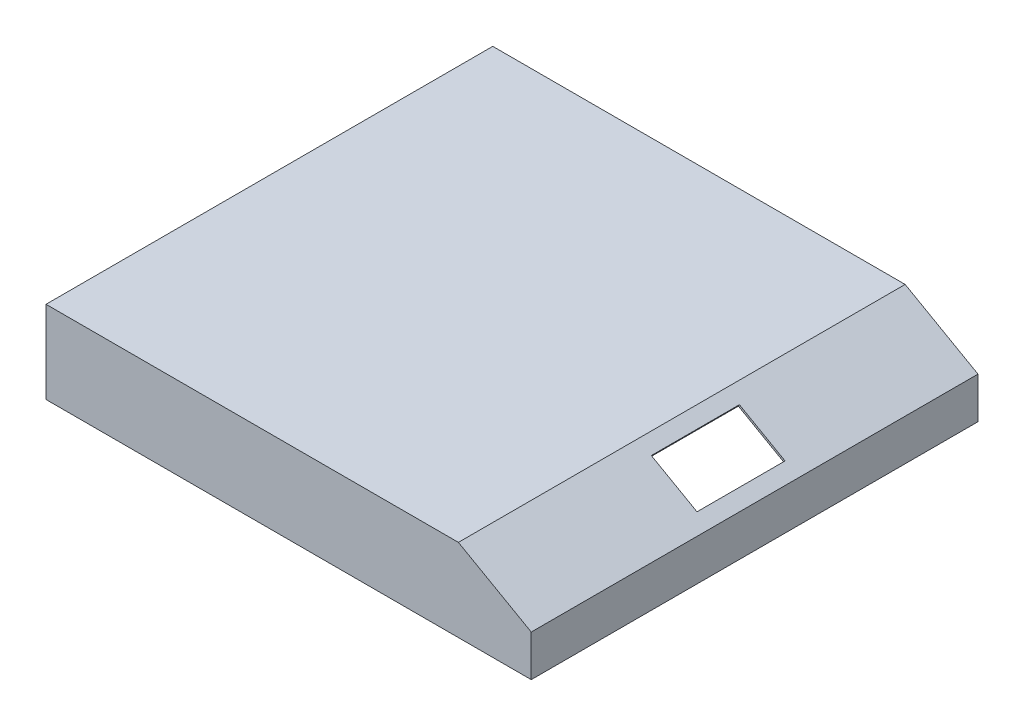
ISO-10303-21;
HEADER;
FILE_DESCRIPTION(('STEP AP214'),'2;1');
FILE_NAME('part.step','',(''),(''),'','','');
FILE_SCHEMA(('AUTOMOTIVE_DESIGN { 1 0 10303 214 1 1 1 1 }'));
ENDSEC;
DATA;
#1=APPLICATION_CONTEXT('core data for automotive mechanical design processes');
#2=APPLICATION_PROTOCOL_DEFINITION('international standard','automotive_design',2000,#1);
#3=PRODUCT_CONTEXT('',#1,'mechanical');
#4=PRODUCT('Part','Part','',(#3));
#5=PRODUCT_RELATED_PRODUCT_CATEGORY('part','',(#4));
#6=PRODUCT_DEFINITION_FORMATION('','',#4);
#7=PRODUCT_DEFINITION_CONTEXT('part definition',#1,'design');
#8=PRODUCT_DEFINITION('design','',#6,#7);
#9=PRODUCT_DEFINITION_SHAPE('','',#8);
#10=(LENGTH_UNIT() NAMED_UNIT(*) SI_UNIT(.MILLI.,.METRE.));
#11=(NAMED_UNIT(*) PLANE_ANGLE_UNIT() SI_UNIT($,.RADIAN.));
#12=(NAMED_UNIT(*) SI_UNIT($,.STERADIAN.) SOLID_ANGLE_UNIT());
#13=UNCERTAINTY_MEASURE_WITH_UNIT(LENGTH_MEASURE(1.E-05),#10,'distance_accuracy_value','');
#14=(GEOMETRIC_REPRESENTATION_CONTEXT(3) GLOBAL_UNCERTAINTY_ASSIGNED_CONTEXT((#13)) GLOBAL_UNIT_ASSIGNED_CONTEXT((#10,
#11,#12)) REPRESENTATION_CONTEXT('',''));
#15=CARTESIAN_POINT('',(0.,0.,0.));
#16=DIRECTION('',(0.,0.,1.));
#17=DIRECTION('',(1.,0.,0.));
#18=AXIS2_PLACEMENT_3D('',#15,#16,#17);
#19=CARTESIAN_POINT('',(705.985097205916,0.,325.));
#20=DIRECTION('',(0.,1.,0.));
#21=DIRECTION('',(0.,0.,1.));
#22=AXIS2_PLACEMENT_3D('',#19,#20,#21);
#23=PLANE('',#22);
#24=DIRECTION('',(1.,0.,0.));
#25=VECTOR('',#24,1.);
#26=CARTESIAN_POINT('',(705.985097205916,0.,-325.));
#27=LINE('',#26,#25);
#28=CARTESIAN_POINT('',(0.,0.,-325.));
#29=VERTEX_POINT('',#28);
#30=CARTESIAN_POINT('',(705.985097205916,0.,-325.));
#31=VERTEX_POINT('',#30);
#32=EDGE_CURVE('E192',#29,#31,#27,.T.);
#33=ORIENTED_EDGE('',*,*,#32,.T.);
#34=DIRECTION('',(0.,0.,-1.));
#35=VECTOR('',#34,1.);
#36=CARTESIAN_POINT('',(705.985097205916,0.,325.));
#37=LINE('',#36,#35);
#38=CARTESIAN_POINT('',(705.985097205916,0.,325.));
#39=VERTEX_POINT('',#38);
#40=EDGE_CURVE('E232',#39,#31,#37,.T.);
#41=ORIENTED_EDGE('',*,*,#40,.F.);
#42=DIRECTION('',(1.,0.,0.));
#43=VECTOR('',#42,1.);
#44=CARTESIAN_POINT('',(705.985097205916,0.,325.));
#45=LINE('',#44,#43);
#46=CARTESIAN_POINT('',(0.,0.,325.));
#47=VERTEX_POINT('',#46);
#48=EDGE_CURVE('E199',#47,#39,#45,.T.);
#49=ORIENTED_EDGE('',*,*,#48,.F.);
#50=DIRECTION('',(0.,0.,-1.));
#51=VECTOR('',#50,1.);
#52=CARTESIAN_POINT('',(0.,0.,325.));
#53=LINE('',#52,#51);
#54=EDGE_CURVE('E211',#47,#29,#53,.T.);
#55=ORIENTED_EDGE('',*,*,#54,.T.);
#56=EDGE_LOOP('',(#33,#41,#49,#55));
#57=FACE_BOUND('',#56,.T.);
#58=DIRECTION('',(1.,0.,0.));
#59=VECTOR('',#58,1.);
#60=CARTESIAN_POINT('',(0.,0.,-322.));
#61=LINE('',#60,#59);
#62=CARTESIAN_POINT('',(3.,0.,-322.));
#63=VERTEX_POINT('',#62);
#64=CARTESIAN_POINT('',(702.985097205916,0.,-322.));
#65=VERTEX_POINT('',#64);
#66=EDGE_CURVE('E158',#63,#65,#61,.T.);
#67=ORIENTED_EDGE('',*,*,#66,.F.);
#68=DIRECTION('',(0.,0.,-1.));
#69=VECTOR('',#68,1.);
#70=CARTESIAN_POINT('',(3.,0.,325.));
#71=LINE('',#70,#69);
#72=CARTESIAN_POINT('',(3.,0.,322.));
#73=VERTEX_POINT('',#72);
#74=EDGE_CURVE('E184',#73,#63,#71,.T.);
#75=ORIENTED_EDGE('',*,*,#74,.F.);
#76=DIRECTION('',(1.,0.,0.));
#77=VECTOR('',#76,1.);
#78=CARTESIAN_POINT('',(0.,0.,322.));
#79=LINE('',#78,#77);
#80=CARTESIAN_POINT('',(702.985097205916,0.,322.));
#81=VERTEX_POINT('',#80);
#82=EDGE_CURVE('E172',#73,#81,#79,.T.);
#83=ORIENTED_EDGE('',*,*,#82,.T.);
#84=DIRECTION('',(0.,0.,-1.));
#85=VECTOR('',#84,1.);
#86=CARTESIAN_POINT('',(702.985097205916,0.,325.));
#87=LINE('',#86,#85);
#88=EDGE_CURVE('E167',#81,#65,#87,.T.);
#89=ORIENTED_EDGE('',*,*,#88,.T.);
#90=EDGE_LOOP('',(#67,#75,#83,#89));
#91=FACE_BOUND('',#90,.T.);
#92=ADVANCED_FACE('F33',(#57,#91),#23,.F.);
#93=CARTESIAN_POINT('',(705.985097205916,60.,325.));
#94=DIRECTION('',(-1.,0.,0.));
#95=DIRECTION('',(0.,0.,1.));
#96=AXIS2_PLACEMENT_3D('',#93,#94,#95);
#97=PLANE('',#96);
#98=DIRECTION('',(0.,1.,0.));
#99=VECTOR('',#98,1.);
#100=CARTESIAN_POINT('',(705.985097205916,60.,-325.));
#101=LINE('',#100,#99);
#102=CARTESIAN_POINT('',(705.985097205916,60.,-325.));
#103=VERTEX_POINT('',#102);
#104=EDGE_CURVE('E214',#31,#103,#101,.T.);
#105=ORIENTED_EDGE('',*,*,#104,.T.);
#106=DIRECTION('',(0.,0.,-1.));
#107=VECTOR('',#106,1.);
#108=CARTESIAN_POINT('',(705.985097205916,60.,325.));
#109=LINE('',#108,#107);
#110=CARTESIAN_POINT('',(705.985097205916,60.,325.));
#111=VERTEX_POINT('',#110);
#112=EDGE_CURVE('E229',#111,#103,#109,.T.);
#113=ORIENTED_EDGE('',*,*,#112,.F.);
#114=DIRECTION('',(0.,1.,0.));
#115=VECTOR('',#114,1.);
#116=CARTESIAN_POINT('',(705.985097205916,60.,325.));
#117=LINE('',#116,#115);
#118=EDGE_CURVE('E202',#39,#111,#117,.T.);
#119=ORIENTED_EDGE('',*,*,#118,.F.);
#120=ORIENTED_EDGE('',*,*,#40,.T.);
#121=EDGE_LOOP('',(#105,#113,#119,#120));
#122=FACE_BOUND('',#121,.T.);
#123=ADVANCED_FACE('F260',(#122),#97,.F.);
#124=CARTESIAN_POINT('',(600.,120.,325.));
#125=DIRECTION('',(-0.492650675035758,-0.870227161370416,0.));
#126=DIRECTION('',(0.870227161370416,-0.492650675035758,0.));
#127=AXIS2_PLACEMENT_3D('',#124,#125,#126);
#128=PLANE('',#127);
#129=DIRECTION('',(-0.870227161370416,0.492650675035758,0.));
#130=VECTOR('',#129,1.);
#131=CARTESIAN_POINT('',(619.758067441577,108.814615660621,-64.0782377758612));
#132=LINE('',#131,#130);
#133=CARTESIAN_POINT('',(686.227029764339,71.185384339379,-64.0782377758611));
#134=VERTEX_POINT('',#133);
#135=CARTESIAN_POINT('',(619.758067441577,108.814615660621,-64.0782377758612));
#136=VERTEX_POINT('',#135);
#137=EDGE_CURVE('E144',#134,#136,#132,.T.);
#138=ORIENTED_EDGE('',*,*,#137,.F.);
#139=DIRECTION('',(0.,0.,-1.));
#140=VECTOR('',#139,1.);
#141=CARTESIAN_POINT('',(686.227029764339,71.1853843393789,-64.0782377758612));
#142=LINE('',#141,#140);
#143=CARTESIAN_POINT('',(686.227029764339,71.1853843393789,64.0782377758612));
#144=VERTEX_POINT('',#143);
#145=EDGE_CURVE('E47',#144,#134,#142,.T.);
#146=ORIENTED_EDGE('',*,*,#145,.F.);
#147=DIRECTION('',(0.870227161370416,-0.492650675035758,0.));
#148=VECTOR('',#147,1.);
#149=CARTESIAN_POINT('',(619.758067441577,108.814615660621,64.0782377758612));
#150=LINE('',#149,#148);
#151=CARTESIAN_POINT('',(619.758067441577,108.814615660621,64.0782377758612));
#152=VERTEX_POINT('',#151);
#153=EDGE_CURVE('E151',#152,#144,#150,.T.);
#154=ORIENTED_EDGE('',*,*,#153,.F.);
#155=DIRECTION('',(0.,0.,1.));
#156=VECTOR('',#155,1.);
#157=CARTESIAN_POINT('',(619.758067441577,108.814615660621,-64.0782377758612));
#158=LINE('',#157,#156);
#159=EDGE_CURVE('E135',#136,#152,#158,.T.);
#160=ORIENTED_EDGE('',*,*,#159,.F.);
#161=EDGE_LOOP('',(#138,#146,#154,#160));
#162=FACE_BOUND('',#161,.T.);
#163=DIRECTION('',(-0.870227161370416,0.492650675035758,0.));
#164=VECTOR('',#163,1.);
#165=CARTESIAN_POINT('',(600.,120.,-325.));
#166=LINE('',#165,#164);
#167=CARTESIAN_POINT('',(600.,120.,-325.));
#168=VERTEX_POINT('',#167);
#169=EDGE_CURVE('E216',#103,#168,#166,.T.);
#170=ORIENTED_EDGE('',*,*,#169,.T.);
#171=DIRECTION('',(0.,0.,-1.));
#172=VECTOR('',#171,1.);
#173=CARTESIAN_POINT('',(600.,120.,325.));
#174=LINE('',#173,#172);
#175=CARTESIAN_POINT('',(600.,120.,325.));
#176=VERTEX_POINT('',#175);
#177=EDGE_CURVE('E226',#176,#168,#174,.T.);
#178=ORIENTED_EDGE('',*,*,#177,.F.);
#179=DIRECTION('',(-0.870227161370416,0.492650675035758,0.));
#180=VECTOR('',#179,1.);
#181=CARTESIAN_POINT('',(600.,120.,325.));
#182=LINE('',#181,#180);
#183=EDGE_CURVE('E205',#111,#176,#182,.T.);
#184=ORIENTED_EDGE('',*,*,#183,.F.);
#185=ORIENTED_EDGE('',*,*,#112,.T.);
#186=EDGE_LOOP('',(#170,#178,#184,#185));
#187=FACE_BOUND('',#186,.T.);
#188=ADVANCED_FACE('F148',(#162,#187),#128,.F.);
#189=CARTESIAN_POINT('',(0.,120.,325.));
#190=DIRECTION('',(0.,-1.,0.));
#191=DIRECTION('',(0.,0.,-1.));
#192=AXIS2_PLACEMENT_3D('',#189,#190,#191);
#193=PLANE('',#192);
#194=DIRECTION('',(-1.,0.,0.));
#195=VECTOR('',#194,1.);
#196=CARTESIAN_POINT('',(0.,120.,-325.));
#197=LINE('',#196,#195);
#198=CARTESIAN_POINT('',(0.,120.,-325.));
#199=VERTEX_POINT('',#198);
#200=EDGE_CURVE('E218',#168,#199,#197,.T.);
#201=ORIENTED_EDGE('',*,*,#200,.T.);
#202=DIRECTION('',(0.,0.,-1.));
#203=VECTOR('',#202,1.);
#204=CARTESIAN_POINT('',(0.,120.,325.));
#205=LINE('',#204,#203);
#206=CARTESIAN_POINT('',(0.,120.,325.));
#207=VERTEX_POINT('',#206);
#208=EDGE_CURVE('E223',#207,#199,#205,.T.);
#209=ORIENTED_EDGE('',*,*,#208,.F.);
#210=DIRECTION('',(-1.,0.,0.));
#211=VECTOR('',#210,1.);
#212=CARTESIAN_POINT('',(0.,120.,325.));
#213=LINE('',#212,#211);
#214=EDGE_CURVE('E207',#176,#207,#213,.T.);
#215=ORIENTED_EDGE('',*,*,#214,.F.);
#216=ORIENTED_EDGE('',*,*,#177,.T.);
#217=EDGE_LOOP('',(#201,#209,#215,#216));
#218=FACE_BOUND('',#217,.T.);
#219=ADVANCED_FACE('F310',(#218),#193,.F.);
#220=CARTESIAN_POINT('',(0.,0.,325.));
#221=DIRECTION('',(1.,0.,0.));
#222=DIRECTION('',(0.,0.,-1.));
#223=AXIS2_PLACEMENT_3D('',#220,#221,#222);
#224=PLANE('',#223);
#225=DIRECTION('',(0.,-1.,0.));
#226=VECTOR('',#225,1.);
#227=CARTESIAN_POINT('',(0.,0.,-325.));
#228=LINE('',#227,#226);
#229=EDGE_CURVE('E203',#199,#29,#228,.T.);
#230=ORIENTED_EDGE('',*,*,#229,.T.);
#231=ORIENTED_EDGE('',*,*,#54,.F.);
#232=DIRECTION('',(0.,-1.,0.));
#233=VECTOR('',#232,1.);
#234=CARTESIAN_POINT('',(0.,0.,325.));
#235=LINE('',#234,#233);
#236=EDGE_CURVE('E209',#207,#47,#235,.T.);
#237=ORIENTED_EDGE('',*,*,#236,.F.);
#238=ORIENTED_EDGE('',*,*,#208,.T.);
#239=EDGE_LOOP('',(#230,#231,#237,#238));
#240=FACE_BOUND('',#239,.T.);
#241=ADVANCED_FACE('F303',(#240),#224,.F.);
#242=CARTESIAN_POINT('',(0.,0.,325.));
#243=DIRECTION('',(0.,0.,-1.));
#244=DIRECTION('',(-1.,0.,0.));
#245=AXIS2_PLACEMENT_3D('',#242,#243,#244);
#246=PLANE('',#245);
#247=ORIENTED_EDGE('',*,*,#48,.T.);
#248=ORIENTED_EDGE('',*,*,#118,.T.);
#249=ORIENTED_EDGE('',*,*,#183,.T.);
#250=ORIENTED_EDGE('',*,*,#214,.T.);
#251=ORIENTED_EDGE('',*,*,#236,.T.);
#252=EDGE_LOOP('',(#247,#248,#249,#250,#251));
#253=FACE_BOUND('',#252,.T.);
#254=ADVANCED_FACE('F299',(#253),#246,.F.);
#255=CARTESIAN_POINT('',(0.,0.,-325.));
#256=DIRECTION('',(0.,0.,-1.));
#257=DIRECTION('',(-1.,0.,0.));
#258=AXIS2_PLACEMENT_3D('',#255,#256,#257);
#259=PLANE('',#258);
#260=ORIENTED_EDGE('',*,*,#32,.F.);
#261=ORIENTED_EDGE('',*,*,#229,.F.);
#262=ORIENTED_EDGE('',*,*,#200,.F.);
#263=ORIENTED_EDGE('',*,*,#169,.F.);
#264=ORIENTED_EDGE('',*,*,#104,.F.);
#265=EDGE_LOOP('',(#260,#261,#262,#263,#264));
#266=FACE_BOUND('',#265,.T.);
#267=ADVANCED_FACE('F302',(#266),#259,.T.);
#268=CARTESIAN_POINT('',(702.985097205916,60.,325.));
#269=DIRECTION('',(-1.,0.,0.));
#270=DIRECTION('',(0.,0.,1.));
#271=AXIS2_PLACEMENT_3D('',#268,#269,#270);
#272=PLANE('',#271);
#273=DIRECTION('',(0.,1.,0.));
#274=VECTOR('',#273,1.);
#275=CARTESIAN_POINT('',(702.985097205916,0.,-322.));
#276=LINE('',#275,#274);
#277=CARTESIAN_POINT('',(702.985097205916,58.2509762479766,-322.));
#278=VERTEX_POINT('',#277);
#279=EDGE_CURVE('E161',#65,#278,#276,.T.);
#280=ORIENTED_EDGE('',*,*,#279,.F.);
#281=ORIENTED_EDGE('',*,*,#88,.F.);
#282=DIRECTION('',(0.,1.,0.));
#283=VECTOR('',#282,1.);
#284=CARTESIAN_POINT('',(702.985097205916,0.,322.));
#285=LINE('',#284,#283);
#286=CARTESIAN_POINT('',(702.985097205916,58.2509762479766,322.));
#287=VERTEX_POINT('',#286);
#288=EDGE_CURVE('E169',#81,#287,#285,.T.);
#289=ORIENTED_EDGE('',*,*,#288,.T.);
#290=DIRECTION('',(0.,0.,-1.));
#291=VECTOR('',#290,1.);
#292=CARTESIAN_POINT('',(702.985097205916,58.2509762479766,325.));
#293=LINE('',#292,#291);
#294=EDGE_CURVE('E164',#287,#278,#293,.T.);
#295=ORIENTED_EDGE('',*,*,#294,.T.);
#296=EDGE_LOOP('',(#280,#281,#289,#295));
#297=FACE_BOUND('',#296,.T.);
#298=ADVANCED_FACE('F283',(#297),#272,.T.);
#299=CARTESIAN_POINT('',(598.522047974893,117.389318515889,325.));
#300=DIRECTION('',(-0.492650675035758,-0.870227161370416,0.));
#301=DIRECTION('',(0.870227161370416,-0.492650675035758,0.));
#302=AXIS2_PLACEMENT_3D('',#299,#300,#301);
#303=PLANE('',#302);
#304=DIRECTION('',(0.,0.,1.));
#305=VECTOR('',#304,1.);
#306=CARTESIAN_POINT('',(684.749077739232,68.5747028552677,325.));
#307=LINE('',#306,#305);
#308=CARTESIAN_POINT('',(684.749077739232,68.5747028552678,-64.0782377758611));
#309=VERTEX_POINT('',#308);
#310=CARTESIAN_POINT('',(684.749077739232,68.5747028552678,64.0782377758611));
#311=VERTEX_POINT('',#310);
#312=EDGE_CURVE('E11',#309,#311,#307,.T.);
#313=ORIENTED_EDGE('',*,*,#312,.F.);
#314=DIRECTION('',(0.870227161370416,-0.492650675035758,0.));
#315=VECTOR('',#314,1.);
#316=CARTESIAN_POINT('',(598.522047974893,117.389318515889,-64.0782377758611));
#317=LINE('',#316,#315);
#318=CARTESIAN_POINT('',(618.28011541647,106.20393417651,-64.0782377758611));
#319=VERTEX_POINT('',#318);
#320=EDGE_CURVE('E235',#319,#309,#317,.T.);
#321=ORIENTED_EDGE('',*,*,#320,.F.);
#322=DIRECTION('',(0.,0.,-1.));
#323=VECTOR('',#322,1.);
#324=CARTESIAN_POINT('',(618.28011541647,106.20393417651,325.));
#325=LINE('',#324,#323);
#326=CARTESIAN_POINT('',(618.28011541647,106.20393417651,64.0782377758612));
#327=VERTEX_POINT('',#326);
#328=EDGE_CURVE('E138',#327,#319,#325,.T.);
#329=ORIENTED_EDGE('',*,*,#328,.F.);
#330=DIRECTION('',(-0.870227161370416,0.492650675035758,0.));
#331=VECTOR('',#330,1.);
#332=CARTESIAN_POINT('',(598.522047974893,117.389318515889,64.0782377758611));
#333=LINE('',#332,#331);
#334=EDGE_CURVE('E40',#311,#327,#333,.T.);
#335=ORIENTED_EDGE('',*,*,#334,.F.);
#336=EDGE_LOOP('',(#313,#321,#329,#335));
#337=FACE_BOUND('',#336,.T.);
#338=DIRECTION('',(-0.870227161370416,0.492650675035758,0.));
#339=VECTOR('',#338,1.);
#340=CARTESIAN_POINT('',(195.591020360836,345.495555092458,-322.));
#341=LINE('',#340,#339);
#342=CARTESIAN_POINT('',(599.209747320735,117.,-322.));
#343=VERTEX_POINT('',#342);
#344=EDGE_CURVE('E163',#278,#343,#341,.T.);
#345=ORIENTED_EDGE('',*,*,#344,.F.);
#346=ORIENTED_EDGE('',*,*,#294,.F.);
#347=DIRECTION('',(-0.870227161370416,0.492650675035758,0.));
#348=VECTOR('',#347,1.);
#349=CARTESIAN_POINT('',(195.591020360836,345.495555092458,322.));
#350=LINE('',#349,#348);
#351=CARTESIAN_POINT('',(599.209747320735,117.,322.));
#352=VERTEX_POINT('',#351);
#353=EDGE_CURVE('E171',#287,#352,#350,.T.);
#354=ORIENTED_EDGE('',*,*,#353,.T.);
#355=DIRECTION('',(0.,0.,-1.));
#356=VECTOR('',#355,1.);
#357=CARTESIAN_POINT('',(599.209747320735,117.,325.));
#358=LINE('',#357,#356);
#359=EDGE_CURVE('E168',#352,#343,#358,.T.);
#360=ORIENTED_EDGE('',*,*,#359,.T.);
#361=EDGE_LOOP('',(#345,#346,#354,#360));
#362=FACE_BOUND('',#361,.T.);
#363=ADVANCED_FACE('F243',(#337,#362),#303,.T.);
#364=CARTESIAN_POINT('',(0.,117.,325.));
#365=DIRECTION('',(0.,-1.,0.));
#366=DIRECTION('',(0.,0.,-1.));
#367=AXIS2_PLACEMENT_3D('',#364,#365,#366);
#368=PLANE('',#367);
#369=DIRECTION('',(-1.,0.,0.));
#370=VECTOR('',#369,1.);
#371=CARTESIAN_POINT('',(0.,117.,-322.));
#372=LINE('',#371,#370);
#373=CARTESIAN_POINT('',(3.,117.,-322.));
#374=VERTEX_POINT('',#373);
#375=EDGE_CURVE('E174',#343,#374,#372,.T.);
#376=ORIENTED_EDGE('',*,*,#375,.F.);
#377=ORIENTED_EDGE('',*,*,#359,.F.);
#378=DIRECTION('',(-1.,0.,0.));
#379=VECTOR('',#378,1.);
#380=CARTESIAN_POINT('',(0.,117.,322.));
#381=LINE('',#380,#379);
#382=CARTESIAN_POINT('',(3.,117.,322.));
#383=VERTEX_POINT('',#382);
#384=EDGE_CURVE('E179',#352,#383,#381,.T.);
#385=ORIENTED_EDGE('',*,*,#384,.T.);
#386=DIRECTION('',(0.,0.,-1.));
#387=VECTOR('',#386,1.);
#388=CARTESIAN_POINT('',(3.,117.,325.));
#389=LINE('',#388,#387);
#390=EDGE_CURVE('E177',#383,#374,#389,.T.);
#391=ORIENTED_EDGE('',*,*,#390,.T.);
#392=EDGE_LOOP('',(#376,#377,#385,#391));
#393=FACE_BOUND('',#392,.T.);
#394=ADVANCED_FACE('F287',(#393),#368,.T.);
#395=CARTESIAN_POINT('',(3.,0.,325.));
#396=DIRECTION('',(1.,0.,0.));
#397=DIRECTION('',(0.,0.,-1.));
#398=AXIS2_PLACEMENT_3D('',#395,#396,#397);
#399=PLANE('',#398);
#400=DIRECTION('',(0.,-1.,0.));
#401=VECTOR('',#400,1.);
#402=CARTESIAN_POINT('',(3.,0.,-322.));
#403=LINE('',#402,#401);
#404=EDGE_CURVE('E181',#374,#63,#403,.T.);
#405=ORIENTED_EDGE('',*,*,#404,.F.);
#406=ORIENTED_EDGE('',*,*,#390,.F.);
#407=DIRECTION('',(0.,-1.,0.));
#408=VECTOR('',#407,1.);
#409=CARTESIAN_POINT('',(3.,0.,322.));
#410=LINE('',#409,#408);
#411=EDGE_CURVE('E186',#383,#73,#410,.T.);
#412=ORIENTED_EDGE('',*,*,#411,.T.);
#413=ORIENTED_EDGE('',*,*,#74,.T.);
#414=EDGE_LOOP('',(#405,#406,#412,#413));
#415=FACE_BOUND('',#414,.T.);
#416=ADVANCED_FACE('F276',(#415),#399,.T.);
#417=CARTESIAN_POINT('',(0.,0.,322.));
#418=DIRECTION('',(0.,0.,-1.));
#419=DIRECTION('',(-1.,0.,0.));
#420=AXIS2_PLACEMENT_3D('',#417,#418,#419);
#421=PLANE('',#420);
#422=ORIENTED_EDGE('',*,*,#82,.F.);
#423=ORIENTED_EDGE('',*,*,#411,.F.);
#424=ORIENTED_EDGE('',*,*,#384,.F.);
#425=ORIENTED_EDGE('',*,*,#353,.F.);
#426=ORIENTED_EDGE('',*,*,#288,.F.);
#427=EDGE_LOOP('',(#422,#423,#424,#425,#426));
#428=FACE_BOUND('',#427,.T.);
#429=ADVANCED_FACE('F254',(#428),#421,.T.);
#430=CARTESIAN_POINT('',(0.,0.,-322.));
#431=DIRECTION('',(0.,0.,-1.));
#432=DIRECTION('',(-1.,0.,0.));
#433=AXIS2_PLACEMENT_3D('',#430,#431,#432);
#434=PLANE('',#433);
#435=ORIENTED_EDGE('',*,*,#66,.T.);
#436=ORIENTED_EDGE('',*,*,#279,.T.);
#437=ORIENTED_EDGE('',*,*,#344,.T.);
#438=ORIENTED_EDGE('',*,*,#375,.T.);
#439=ORIENTED_EDGE('',*,*,#404,.T.);
#440=EDGE_LOOP('',(#435,#436,#437,#438,#439));
#441=FACE_BOUND('',#440,.T.);
#442=ADVANCED_FACE('F247',(#441),#434,.F.);
#443=CARTESIAN_POINT('',(489.158057378396,-276.920852237191,-64.0782377758612));
#444=DIRECTION('',(0.870227161370416,-0.492650675035758,0.));
#445=DIRECTION('',(0.492650675035758,0.870227161370416,0.));
#446=AXIS2_PLACEMENT_3D('',#443,#444,#445);
#447=PLANE('',#446);
#448=ORIENTED_EDGE('',*,*,#312,.T.);
#449=DIRECTION('',(0.492650675035758,0.870227161370416,0.));
#450=VECTOR('',#449,1.);
#451=CARTESIAN_POINT('',(489.158057378396,-276.920852237191,64.0782377758612));
#452=LINE('',#451,#450);
#453=EDGE_CURVE('E156',#311,#144,#452,.T.);
#454=ORIENTED_EDGE('',*,*,#453,.T.);
#455=ORIENTED_EDGE('',*,*,#145,.T.);
#456=DIRECTION('',(0.492650675035758,0.870227161370416,0.));
#457=VECTOR('',#456,1.);
#458=CARTESIAN_POINT('',(489.158057378396,-276.920852237191,-64.0782377758612));
#459=LINE('',#458,#457);
#460=EDGE_CURVE('E141',#309,#134,#459,.T.);
#461=ORIENTED_EDGE('',*,*,#460,.F.);
#462=EDGE_LOOP('',(#448,#454,#455,#461));
#463=FACE_BOUND('',#462,.T.);
#464=ADVANCED_FACE('F245',(#463),#447,.F.);
#465=CARTESIAN_POINT('',(422.689095055634,-239.291620915948,64.0782377758612));
#466=DIRECTION('',(0.,0.,1.));
#467=DIRECTION('',(1.,0.,0.));
#468=AXIS2_PLACEMENT_3D('',#465,#466,#467);
#469=PLANE('',#468);
#470=ORIENTED_EDGE('',*,*,#334,.T.);
#471=DIRECTION('',(0.492650675035758,0.870227161370416,0.));
#472=VECTOR('',#471,1.);
#473=CARTESIAN_POINT('',(422.689095055634,-239.291620915948,64.0782377758612));
#474=LINE('',#473,#472);
#475=EDGE_CURVE('E140',#327,#152,#474,.T.);
#476=ORIENTED_EDGE('',*,*,#475,.T.);
#477=ORIENTED_EDGE('',*,*,#153,.T.);
#478=ORIENTED_EDGE('',*,*,#453,.F.);
#479=EDGE_LOOP('',(#470,#476,#477,#478));
#480=FACE_BOUND('',#479,.T.);
#481=ADVANCED_FACE('F240',(#480),#469,.F.);
#482=CARTESIAN_POINT('',(422.689095055634,-239.291620915948,-64.0782377758612));
#483=DIRECTION('',(-0.870227161370416,0.492650675035758,0.));
#484=DIRECTION('',(-0.492650675035758,-0.870227161370416,0.));
#485=AXIS2_PLACEMENT_3D('',#482,#483,#484);
#486=PLANE('',#485);
#487=ORIENTED_EDGE('',*,*,#328,.T.);
#488=DIRECTION('',(0.492650675035758,0.870227161370416,0.));
#489=VECTOR('',#488,1.);
#490=CARTESIAN_POINT('',(422.689095055634,-239.291620915948,-64.0782377758612));
#491=LINE('',#490,#489);
#492=EDGE_CURVE('E55',#319,#136,#491,.T.);
#493=ORIENTED_EDGE('',*,*,#492,.T.);
#494=ORIENTED_EDGE('',*,*,#159,.T.);
#495=ORIENTED_EDGE('',*,*,#475,.F.);
#496=EDGE_LOOP('',(#487,#493,#494,#495));
#497=FACE_BOUND('',#496,.T.);
#498=ADVANCED_FACE('F132',(#497),#486,.F.);
#499=CARTESIAN_POINT('',(422.689095055634,-239.291620915948,-64.0782377758612));
#500=DIRECTION('',(0.,0.,-1.));
#501=DIRECTION('',(-1.,0.,0.));
#502=AXIS2_PLACEMENT_3D('',#499,#500,#501);
#503=PLANE('',#502);
#504=ORIENTED_EDGE('',*,*,#320,.T.);
#505=ORIENTED_EDGE('',*,*,#460,.T.);
#506=ORIENTED_EDGE('',*,*,#137,.T.);
#507=ORIENTED_EDGE('',*,*,#492,.F.);
#508=EDGE_LOOP('',(#504,#505,#506,#507));
#509=FACE_BOUND('',#508,.T.);
#510=ADVANCED_FACE('F145',(#509),#503,.F.);
#511=CLOSED_SHELL('',(#92,#123,#188,#219,#241,#254,#267,#298,#363,#394,#416,#429,#442,#464,#481,
#498,#510));
#512=MANIFOLD_SOLID_BREP('B2',#511);
#513=ADVANCED_BREP_SHAPE_REPRESENTATION('',(#18,#512),#14);
#514=SHAPE_DEFINITION_REPRESENTATION(#9,#513);
ENDSEC;
END-ISO-10303-21;
